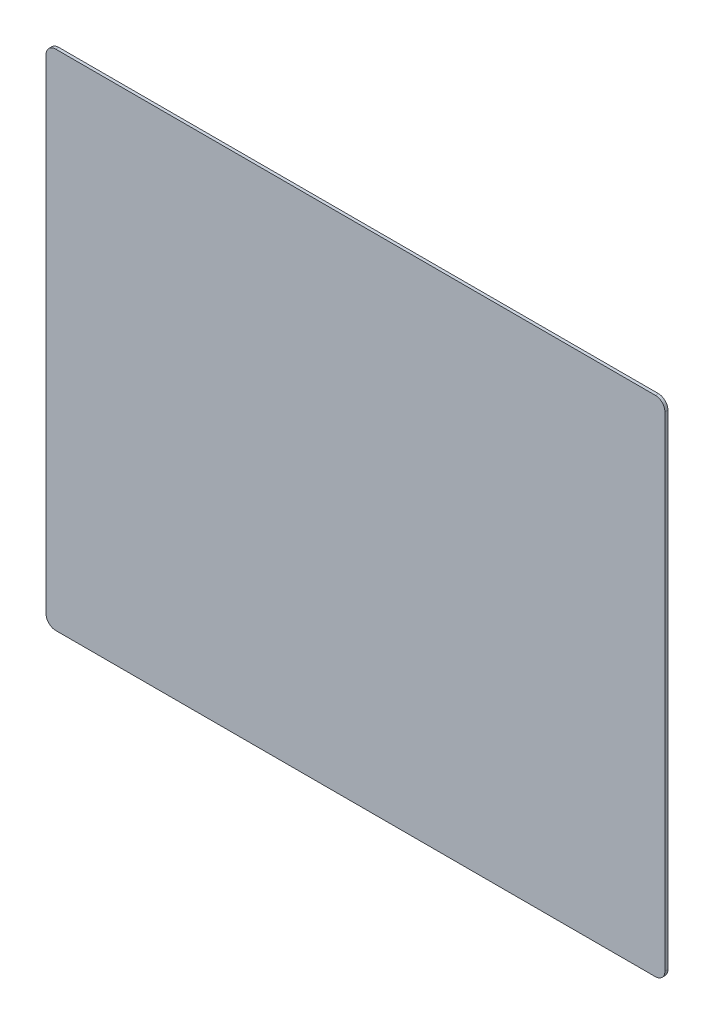
ISO-10303-21;
HEADER;
FILE_DESCRIPTION(('STEP AP214'),'2;1');
FILE_NAME('part.step','',(''),(''),'','','');
FILE_SCHEMA(('AUTOMOTIVE_DESIGN { 1 0 10303 214 1 1 1 1 }'));
ENDSEC;
DATA;
#1=APPLICATION_CONTEXT('core data for automotive mechanical design processes');
#2=APPLICATION_PROTOCOL_DEFINITION('international standard','automotive_design',2000,#1);
#3=PRODUCT_CONTEXT('',#1,'mechanical');
#4=PRODUCT('Part','Part','',(#3));
#5=PRODUCT_RELATED_PRODUCT_CATEGORY('part','',(#4));
#6=PRODUCT_DEFINITION_FORMATION('','',#4);
#7=PRODUCT_DEFINITION_CONTEXT('part definition',#1,'design');
#8=PRODUCT_DEFINITION('design','',#6,#7);
#9=PRODUCT_DEFINITION_SHAPE('','',#8);
#10=(LENGTH_UNIT() NAMED_UNIT(*) SI_UNIT(.MILLI.,.METRE.));
#11=(NAMED_UNIT(*) PLANE_ANGLE_UNIT() SI_UNIT($,.RADIAN.));
#12=(NAMED_UNIT(*) SI_UNIT($,.STERADIAN.) SOLID_ANGLE_UNIT());
#13=UNCERTAINTY_MEASURE_WITH_UNIT(LENGTH_MEASURE(1.E-05),#10,'distance_accuracy_value','');
#14=(GEOMETRIC_REPRESENTATION_CONTEXT(3) GLOBAL_UNCERTAINTY_ASSIGNED_CONTEXT((#13)) GLOBAL_UNIT_ASSIGNED_CONTEXT((#10,
#11,#12)) REPRESENTATION_CONTEXT('',''));
#15=CARTESIAN_POINT('',(0.,0.,0.));
#16=DIRECTION('',(0.,0.,1.));
#17=DIRECTION('',(1.,0.,0.));
#18=AXIS2_PLACEMENT_3D('',#15,#16,#17);
#19=CARTESIAN_POINT('',(-476.498046875,137.467578125,3.175));
#20=DIRECTION('',(1.,0.,0.));
#21=DIRECTION('',(0.,1.,0.));
#22=AXIS2_PLACEMENT_3D('',#19,#20,#21);
#23=PLANE('',#22);
#24=DIRECTION('',(0.,-1.,0.));
#25=VECTOR('',#24,1.);
#26=CARTESIAN_POINT('',(-476.498046875,137.467578125,0.));
#27=LINE('',#26,#25);
#28=CARTESIAN_POINT('',(-476.498046875,127.467578125,0.));
#29=VERTEX_POINT('',#28);
#30=CARTESIAN_POINT('',(-476.498046875,-379.508421875,0.));
#31=VERTEX_POINT('',#30);
#32=EDGE_CURVE('E172',#29,#31,#27,.T.);
#33=ORIENTED_EDGE('',*,*,#32,.T.);
#34=DIRECTION('',(0.,0.,-1.));
#35=VECTOR('',#34,1.);
#36=CARTESIAN_POINT('',(-476.498046875,-379.508421875,3.175));
#37=LINE('',#36,#35);
#38=CARTESIAN_POINT('',(-476.498046875,-379.508421875,3.175));
#39=VERTEX_POINT('',#38);
#40=EDGE_CURVE('E159',#31,#39,#37,.F.);
#41=ORIENTED_EDGE('',*,*,#40,.T.);
#42=DIRECTION('',(0.,-1.,0.));
#43=VECTOR('',#42,1.);
#44=CARTESIAN_POINT('',(-476.498046875,137.467578125,3.175));
#45=LINE('',#44,#43);
#46=CARTESIAN_POINT('',(-476.498046875,127.467578125,3.175));
#47=VERTEX_POINT('',#46);
#48=EDGE_CURVE('E174',#47,#39,#45,.T.);
#49=ORIENTED_EDGE('',*,*,#48,.F.);
#50=DIRECTION('',(0.,0.,-1.));
#51=VECTOR('',#50,1.);
#52=CARTESIAN_POINT('',(-476.498046875,127.467578125,0.));
#53=LINE('',#52,#51);
#54=EDGE_CURVE('E156',#47,#29,#53,.T.);
#55=ORIENTED_EDGE('',*,*,#54,.T.);
#56=EDGE_LOOP('',(#33,#41,#49,#55));
#57=FACE_BOUND('',#56,.T.);
#58=ADVANCED_FACE('F47',(#57),#23,.F.);
#59=CARTESIAN_POINT('',(-476.498046875,-389.508421875,3.175));
#60=DIRECTION('',(0.,1.,0.));
#61=DIRECTION('',(0.,0.,1.));
#62=AXIS2_PLACEMENT_3D('',#59,#60,#61);
#63=PLANE('',#62);
#64=DIRECTION('',(1.,0.,0.));
#65=VECTOR('',#64,1.);
#66=CARTESIAN_POINT('',(-476.498046875,-389.508421875,0.));
#67=LINE('',#66,#65);
#68=CARTESIAN_POINT('',(-466.498046875,-389.508421875,0.));
#69=VERTEX_POINT('',#68);
#70=CARTESIAN_POINT('',(161.201953125,-389.508421875,0.));
#71=VERTEX_POINT('',#70);
#72=EDGE_CURVE('E130',#69,#71,#67,.T.);
#73=ORIENTED_EDGE('',*,*,#72,.T.);
#74=DIRECTION('',(0.,0.,-1.));
#75=VECTOR('',#74,1.);
#76=CARTESIAN_POINT('',(161.201953125,-389.508421875,3.175));
#77=LINE('',#76,#75);
#78=CARTESIAN_POINT('',(161.201953125,-389.508421875,3.175));
#79=VERTEX_POINT('',#78);
#80=EDGE_CURVE('E147',#71,#79,#77,.F.);
#81=ORIENTED_EDGE('',*,*,#80,.T.);
#82=DIRECTION('',(1.,0.,0.));
#83=VECTOR('',#82,1.);
#84=CARTESIAN_POINT('',(-476.498046875,-389.508421875,3.175));
#85=LINE('',#84,#83);
#86=CARTESIAN_POINT('',(-466.498046875,-389.508421875,3.175));
#87=VERTEX_POINT('',#86);
#88=EDGE_CURVE('E181',#87,#79,#85,.T.);
#89=ORIENTED_EDGE('',*,*,#88,.F.);
#90=DIRECTION('',(0.,0.,-1.));
#91=VECTOR('',#90,1.);
#92=CARTESIAN_POINT('',(-466.498046875,-389.508421875,3.175));
#93=LINE('',#92,#91);
#94=EDGE_CURVE('E144',#87,#69,#93,.T.);
#95=ORIENTED_EDGE('',*,*,#94,.T.);
#96=EDGE_LOOP('',(#73,#81,#89,#95));
#97=FACE_BOUND('',#96,.T.);
#98=ADVANCED_FACE('F189',(#97),#63,.F.);
#99=CARTESIAN_POINT('',(171.201953125,137.467578125,3.175));
#100=DIRECTION('',(1.,0.,0.));
#101=DIRECTION('',(0.,1.,0.));
#102=AXIS2_PLACEMENT_3D('',#99,#100,#101);
#103=PLANE('',#102);
#104=DIRECTION('',(0.,-1.,0.));
#105=VECTOR('',#104,1.);
#106=CARTESIAN_POINT('',(171.201953125,137.467578125,3.175));
#107=LINE('',#106,#105);
#108=CARTESIAN_POINT('',(171.201953125,127.467578125,3.175));
#109=VERTEX_POINT('',#108);
#110=CARTESIAN_POINT('',(171.201953125,-379.508421875,3.175));
#111=VERTEX_POINT('',#110);
#112=EDGE_CURVE('E135',#109,#111,#107,.T.);
#113=ORIENTED_EDGE('',*,*,#112,.T.);
#114=DIRECTION('',(0.,0.,-1.));
#115=VECTOR('',#114,1.);
#116=CARTESIAN_POINT('',(171.201953125,-379.508421875,0.));
#117=LINE('',#116,#115);
#118=CARTESIAN_POINT('',(171.201953125,-379.508421875,0.));
#119=VERTEX_POINT('',#118);
#120=EDGE_CURVE('E122',#111,#119,#117,.T.);
#121=ORIENTED_EDGE('',*,*,#120,.T.);
#122=DIRECTION('',(0.,-1.,0.));
#123=VECTOR('',#122,1.);
#124=CARTESIAN_POINT('',(171.201953125,137.467578125,0.));
#125=LINE('',#124,#123);
#126=CARTESIAN_POINT('',(171.201953125,127.467578125,0.));
#127=VERTEX_POINT('',#126);
#128=EDGE_CURVE('E115',#127,#119,#125,.T.);
#129=ORIENTED_EDGE('',*,*,#128,.F.);
#130=DIRECTION('',(0.,0.,-1.));
#131=VECTOR('',#130,1.);
#132=CARTESIAN_POINT('',(171.201953125,127.467578125,3.175));
#133=LINE('',#132,#131);
#134=EDGE_CURVE('E128',#127,#109,#133,.F.);
#135=ORIENTED_EDGE('',*,*,#134,.T.);
#136=EDGE_LOOP('',(#113,#121,#129,#135));
#137=FACE_BOUND('',#136,.T.);
#138=ADVANCED_FACE('F127',(#137),#103,.T.);
#139=CARTESIAN_POINT('',(-476.498046875,137.467578125,3.175));
#140=DIRECTION('',(0.,1.,0.));
#141=DIRECTION('',(0.,0.,1.));
#142=AXIS2_PLACEMENT_3D('',#139,#140,#141);
#143=PLANE('',#142);
#144=DIRECTION('',(1.,0.,0.));
#145=VECTOR('',#144,1.);
#146=CARTESIAN_POINT('',(-476.498046875,137.467578125,0.));
#147=LINE('',#146,#145);
#148=CARTESIAN_POINT('',(-466.498046875,137.467578125,0.));
#149=VERTEX_POINT('',#148);
#150=CARTESIAN_POINT('',(161.201953125,137.467578125,0.));
#151=VERTEX_POINT('',#150);
#152=EDGE_CURVE('E116',#149,#151,#147,.T.);
#153=ORIENTED_EDGE('',*,*,#152,.F.);
#154=DIRECTION('',(0.,0.,-1.));
#155=VECTOR('',#154,1.);
#156=CARTESIAN_POINT('',(-466.498046875,137.467578125,3.175));
#157=LINE('',#156,#155);
#158=CARTESIAN_POINT('',(-466.498046875,137.467578125,3.175));
#159=VERTEX_POINT('',#158);
#160=EDGE_CURVE('E11',#149,#159,#157,.F.);
#161=ORIENTED_EDGE('',*,*,#160,.T.);
#162=DIRECTION('',(1.,0.,0.));
#163=VECTOR('',#162,1.);
#164=CARTESIAN_POINT('',(-476.498046875,137.467578125,3.175));
#165=LINE('',#164,#163);
#166=CARTESIAN_POINT('',(161.201953125,137.467578125,3.175));
#167=VERTEX_POINT('',#166);
#168=EDGE_CURVE('E132',#159,#167,#165,.T.);
#169=ORIENTED_EDGE('',*,*,#168,.T.);
#170=DIRECTION('',(0.,0.,-1.));
#171=VECTOR('',#170,1.);
#172=CARTESIAN_POINT('',(161.201953125,137.467578125,3.175));
#173=LINE('',#172,#171);
#174=EDGE_CURVE('E55',#167,#151,#173,.T.);
#175=ORIENTED_EDGE('',*,*,#174,.T.);
#176=EDGE_LOOP('',(#153,#161,#169,#175));
#177=FACE_BOUND('',#176,.T.);
#178=ADVANCED_FACE('F160',(#177),#143,.T.);
#179=CARTESIAN_POINT('',(0.,0.,3.175));
#180=DIRECTION('',(0.,0.,1.));
#181=DIRECTION('',(1.,0.,0.));
#182=AXIS2_PLACEMENT_3D('',#179,#180,#181);
#183=PLANE('',#182);
#184=ORIENTED_EDGE('',*,*,#88,.T.);
#185=CARTESIAN_POINT('',(161.201953125,-379.508421875,3.175));
#186=DIRECTION('',(0.,0.,1.));
#187=DIRECTION('',(1.,0.,0.));
#188=AXIS2_PLACEMENT_3D('',#185,#186,#187);
#189=CIRCLE('',#188,10.);
#190=EDGE_CURVE('E154',#79,#111,#189,.T.);
#191=ORIENTED_EDGE('',*,*,#190,.T.);
#192=ORIENTED_EDGE('',*,*,#112,.F.);
#193=CARTESIAN_POINT('',(161.201953125,127.467578125,3.175));
#194=DIRECTION('',(0.,0.,1.));
#195=DIRECTION('',(1.,0.,0.));
#196=AXIS2_PLACEMENT_3D('',#193,#194,#195);
#197=CIRCLE('',#196,10.);
#198=EDGE_CURVE('E62',#109,#167,#197,.T.);
#199=ORIENTED_EDGE('',*,*,#198,.T.);
#200=ORIENTED_EDGE('',*,*,#168,.F.);
#201=CARTESIAN_POINT('',(-466.498046875,127.467578125,3.175));
#202=DIRECTION('',(0.,0.,1.));
#203=DIRECTION('',(1.,0.,0.));
#204=AXIS2_PLACEMENT_3D('',#201,#202,#203);
#205=CIRCLE('',#204,10.);
#206=EDGE_CURVE('E150',#159,#47,#205,.T.);
#207=ORIENTED_EDGE('',*,*,#206,.T.);
#208=ORIENTED_EDGE('',*,*,#48,.T.);
#209=CARTESIAN_POINT('',(-466.498046875,-379.508421875,3.175));
#210=DIRECTION('',(0.,0.,1.));
#211=DIRECTION('',(1.,0.,0.));
#212=AXIS2_PLACEMENT_3D('',#209,#210,#211);
#213=CIRCLE('',#212,10.);
#214=EDGE_CURVE('E152',#39,#87,#213,.T.);
#215=ORIENTED_EDGE('',*,*,#214,.T.);
#216=EDGE_LOOP('',(#184,#191,#192,#199,#200,#207,#208,#215));
#217=FACE_BOUND('',#216,.T.);
#218=ADVANCED_FACE('F163',(#217),#183,.T.);
#219=CARTESIAN_POINT('',(0.,0.,0.));
#220=DIRECTION('',(0.,0.,1.));
#221=DIRECTION('',(1.,0.,0.));
#222=AXIS2_PLACEMENT_3D('',#219,#220,#221);
#223=PLANE('',#222);
#224=ORIENTED_EDGE('',*,*,#128,.T.);
#225=CARTESIAN_POINT('',(161.201953125,-379.508421875,0.));
#226=DIRECTION('',(0.,0.,1.));
#227=DIRECTION('',(1.,0.,0.));
#228=AXIS2_PLACEMENT_3D('',#225,#226,#227);
#229=CIRCLE('',#228,10.);
#230=EDGE_CURVE('E142',#119,#71,#229,.F.);
#231=ORIENTED_EDGE('',*,*,#230,.T.);
#232=ORIENTED_EDGE('',*,*,#72,.F.);
#233=CARTESIAN_POINT('',(-466.498046875,-379.508421875,0.));
#234=DIRECTION('',(0.,0.,1.));
#235=DIRECTION('',(1.,0.,0.));
#236=AXIS2_PLACEMENT_3D('',#233,#234,#235);
#237=CIRCLE('',#236,10.);
#238=EDGE_CURVE('E140',#69,#31,#237,.F.);
#239=ORIENTED_EDGE('',*,*,#238,.T.);
#240=ORIENTED_EDGE('',*,*,#32,.F.);
#241=CARTESIAN_POINT('',(-466.498046875,127.467578125,0.));
#242=DIRECTION('',(0.,0.,1.));
#243=DIRECTION('',(1.,0.,0.));
#244=AXIS2_PLACEMENT_3D('',#241,#242,#243);
#245=CIRCLE('',#244,10.);
#246=EDGE_CURVE('E121',#29,#149,#245,.F.);
#247=ORIENTED_EDGE('',*,*,#246,.T.);
#248=ORIENTED_EDGE('',*,*,#152,.T.);
#249=CARTESIAN_POINT('',(161.201953125,127.467578125,0.));
#250=DIRECTION('',(0.,0.,1.));
#251=DIRECTION('',(1.,0.,0.));
#252=AXIS2_PLACEMENT_3D('',#249,#250,#251);
#253=CIRCLE('',#252,10.);
#254=EDGE_CURVE('E112',#151,#127,#253,.F.);
#255=ORIENTED_EDGE('',*,*,#254,.T.);
#256=EDGE_LOOP('',(#224,#231,#232,#239,#240,#247,#248,#255));
#257=FACE_BOUND('',#256,.T.);
#258=ADVANCED_FACE('F114',(#257),#223,.F.);
#259=CARTESIAN_POINT('',(161.201953125,-379.508421875,3.175));
#260=DIRECTION('',(0.,0.,1.));
#261=DIRECTION('',(1.,0.,0.));
#262=AXIS2_PLACEMENT_3D('',#259,#260,#261);
#263=CYLINDRICAL_SURFACE('',#262,10.);
#264=ORIENTED_EDGE('',*,*,#190,.F.);
#265=ORIENTED_EDGE('',*,*,#80,.F.);
#266=ORIENTED_EDGE('',*,*,#230,.F.);
#267=ORIENTED_EDGE('',*,*,#120,.F.);
#268=EDGE_LOOP('',(#264,#265,#266,#267));
#269=FACE_BOUND('',#268,.T.);
#270=ADVANCED_FACE('F193',(#269),#263,.T.);
#271=CARTESIAN_POINT('',(-466.498046875,-379.508421875,3.175));
#272=DIRECTION('',(0.,0.,-1.));
#273=DIRECTION('',(-1.,0.,0.));
#274=AXIS2_PLACEMENT_3D('',#271,#272,#273);
#275=CYLINDRICAL_SURFACE('',#274,10.);
#276=ORIENTED_EDGE('',*,*,#214,.F.);
#277=ORIENTED_EDGE('',*,*,#40,.F.);
#278=ORIENTED_EDGE('',*,*,#238,.F.);
#279=ORIENTED_EDGE('',*,*,#94,.F.);
#280=EDGE_LOOP('',(#276,#277,#278,#279));
#281=FACE_BOUND('',#280,.T.);
#282=ADVANCED_FACE('F187',(#281),#275,.T.);
#283=CARTESIAN_POINT('',(-466.498046875,127.467578125,3.175));
#284=DIRECTION('',(0.,0.,1.));
#285=DIRECTION('',(1.,0.,0.));
#286=AXIS2_PLACEMENT_3D('',#283,#284,#285);
#287=CYLINDRICAL_SURFACE('',#286,10.);
#288=ORIENTED_EDGE('',*,*,#206,.F.);
#289=ORIENTED_EDGE('',*,*,#160,.F.);
#290=ORIENTED_EDGE('',*,*,#246,.F.);
#291=ORIENTED_EDGE('',*,*,#54,.F.);
#292=EDGE_LOOP('',(#288,#289,#290,#291));
#293=FACE_BOUND('',#292,.T.);
#294=ADVANCED_FACE('F168',(#293),#287,.T.);
#295=CARTESIAN_POINT('',(161.201953125,127.467578125,3.175));
#296=DIRECTION('',(0.,0.,-1.));
#297=DIRECTION('',(-1.,0.,0.));
#298=AXIS2_PLACEMENT_3D('',#295,#296,#297);
#299=CYLINDRICAL_SURFACE('',#298,10.);
#300=ORIENTED_EDGE('',*,*,#198,.F.);
#301=ORIENTED_EDGE('',*,*,#134,.F.);
#302=ORIENTED_EDGE('',*,*,#254,.F.);
#303=ORIENTED_EDGE('',*,*,#174,.F.);
#304=EDGE_LOOP('',(#300,#301,#302,#303));
#305=FACE_BOUND('',#304,.T.);
#306=ADVANCED_FACE('F49',(#305),#299,.T.);
#307=CLOSED_SHELL('',(#58,#98,#138,#178,#218,#258,#270,#282,#294,#306));
#308=MANIFOLD_SOLID_BREP('B2',#307);
#309=ADVANCED_BREP_SHAPE_REPRESENTATION('',(#18,#308),#14);
#310=SHAPE_DEFINITION_REPRESENTATION(#9,#309);
ENDSEC;
END-ISO-10303-21;
